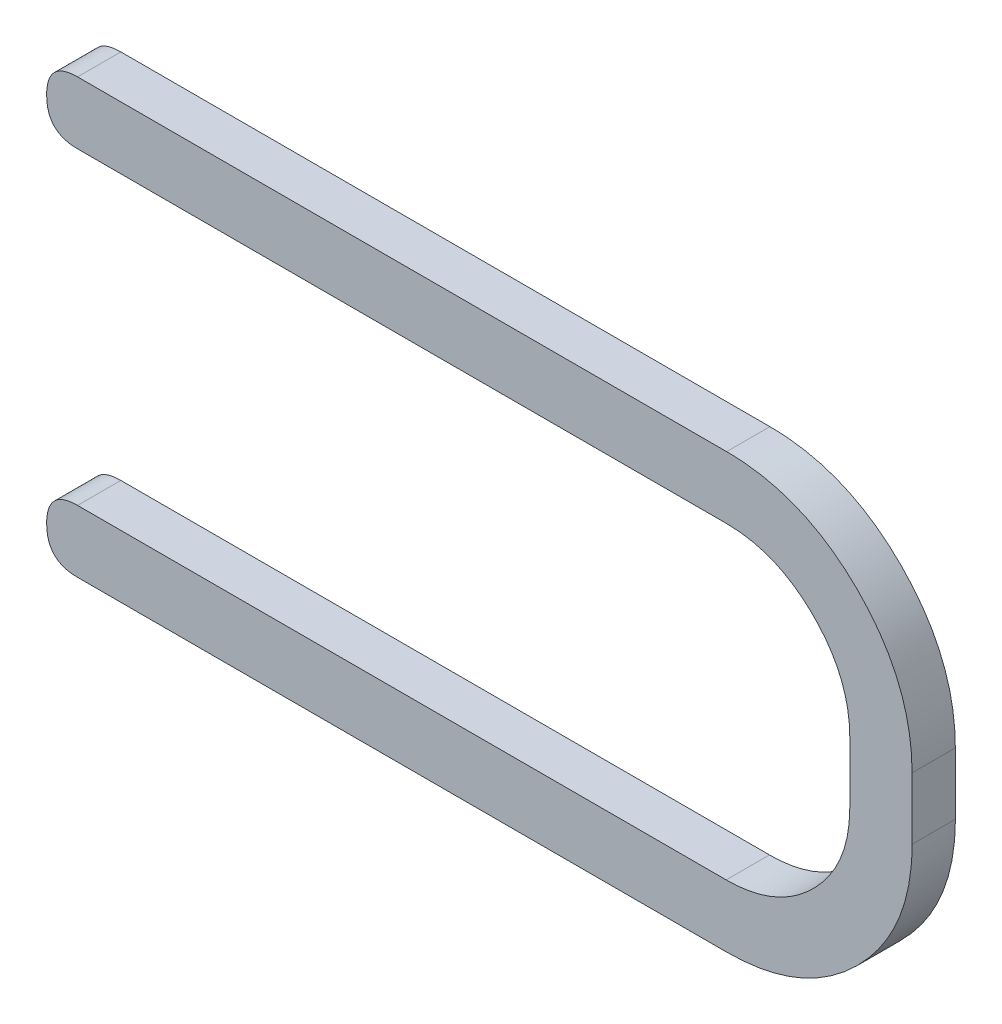
ISO-10303-21;
HEADER;
FILE_DESCRIPTION(('STEP AP214'),'2;1');
FILE_NAME('part.step','',(''),(''),'','','');
FILE_SCHEMA(('AUTOMOTIVE_DESIGN { 1 0 10303 214 1 1 1 1 }'));
ENDSEC;
DATA;
#1=APPLICATION_CONTEXT('core data for automotive mechanical design processes');
#2=APPLICATION_PROTOCOL_DEFINITION('international standard','automotive_design',2000,#1);
#3=PRODUCT_CONTEXT('',#1,'mechanical');
#4=PRODUCT('Part','Part','',(#3));
#5=PRODUCT_RELATED_PRODUCT_CATEGORY('part','',(#4));
#6=PRODUCT_DEFINITION_FORMATION('','',#4);
#7=PRODUCT_DEFINITION_CONTEXT('part definition',#1,'design');
#8=PRODUCT_DEFINITION('design','',#6,#7);
#9=PRODUCT_DEFINITION_SHAPE('','',#8);
#10=(LENGTH_UNIT() NAMED_UNIT(*) SI_UNIT(.MILLI.,.METRE.));
#11=(NAMED_UNIT(*) PLANE_ANGLE_UNIT() SI_UNIT($,.RADIAN.));
#12=(NAMED_UNIT(*) SI_UNIT($,.STERADIAN.) SOLID_ANGLE_UNIT());
#13=UNCERTAINTY_MEASURE_WITH_UNIT(LENGTH_MEASURE(1.E-05),#10,'distance_accuracy_value','');
#14=(GEOMETRIC_REPRESENTATION_CONTEXT(3) GLOBAL_UNCERTAINTY_ASSIGNED_CONTEXT((#13)) GLOBAL_UNIT_ASSIGNED_CONTEXT((#10,
#11,#12)) REPRESENTATION_CONTEXT('',''));
#15=CARTESIAN_POINT('',(0.,0.,0.));
#16=DIRECTION('',(0.,0.,1.));
#17=DIRECTION('',(1.,0.,0.));
#18=AXIS2_PLACEMENT_3D('',#15,#16,#17);
#19=CARTESIAN_POINT('',(0.8,12.2,-2.6));
#20=DIRECTION('',(0.,0.,1.));
#21=DIRECTION('',(1.,0.,0.));
#22=AXIS2_PLACEMENT_3D('',#19,#20,#21);
#23=PLANE('',#22);
#24=CARTESIAN_POINT('',(-2.2986,15.6116,-2.6));
#25=CARTESIAN_POINT('',(-2.37,15.6116,-2.6));
#26=CARTESIAN_POINT('',(-2.37,15.5396,-2.6));
#27=B_SPLINE_CURVE_WITH_KNOTS('',2,(#24,#25,#26),.UNSPECIFIED.,.F.,.F.,(3,3),(0.,1.),.UNSPECIFIED.);
#28=CARTESIAN_POINT('',(-2.2986,15.6116,-2.6));
#29=VERTEX_POINT('',#28);
#30=CARTESIAN_POINT('',(-2.37,15.5396,-2.6));
#31=VERTEX_POINT('',#30);
#32=EDGE_CURVE('E175',#29,#31,#27,.T.);
#33=ORIENTED_EDGE('',*,*,#32,.T.);
#34=CARTESIAN_POINT('',(-2.37,15.5396,-2.6));
#35=CARTESIAN_POINT('',(-2.37,15.4676,-2.6));
#36=CARTESIAN_POINT('',(-2.29855,15.4676,-2.6));
#37=B_SPLINE_CURVE_WITH_KNOTS('',2,(#34,#35,#36),.UNSPECIFIED.,.F.,.F.,(3,3),(0.,1.),.UNSPECIFIED.);
#38=CARTESIAN_POINT('',(-2.29855,15.4676,-2.6));
#39=VERTEX_POINT('',#38);
#40=EDGE_CURVE('E137',#31,#39,#37,.T.);
#41=ORIENTED_EDGE('',*,*,#40,.T.);
#42=DIRECTION('',(1.,0.,0.));
#43=VECTOR('',#42,1.);
#44=CARTESIAN_POINT('',(-2.29855,15.4676,-2.6));
#45=LINE('',#44,#43);
#46=CARTESIAN_POINT('',(-0.79855,15.4676,-2.6));
#47=VERTEX_POINT('',#46);
#48=EDGE_CURVE('E132',#47,#39,#45,.F.);
#49=ORIENTED_EDGE('',*,*,#48,.F.);
#50=CARTESIAN_POINT('',(-0.79855,15.4676,-2.6));
#51=CARTESIAN_POINT('',(-0.785758754690316,15.4676000873071,-2.6));
#52=CARTESIAN_POINT('',(-0.772967884589739,15.4680850022665,-2.6));
#53=CARTESIAN_POINT('',(-0.747456477785844,15.4701104376666,-2.6));
#54=CARTESIAN_POINT('',(-0.734736038734417,15.4716521698536,-2.6));
#55=CARTESIAN_POINT('',(-0.697046095054838,15.4779540294479,-2.6));
#56=CARTESIAN_POINT('',(-0.672325320018481,15.4843880502214,-2.6));
#57=CARTESIAN_POINT('',(-0.624425176586373,15.5019679591174,-2.6));
#58=CARTESIAN_POINT('',(-0.601257986872031,15.5131469491276,-2.6));
#59=CARTESIAN_POINT('',(-0.557420812279757,15.5397049989876,-2.6));
#60=CARTESIAN_POINT('',(-0.536756010980438,15.555092569025,-2.6));
#61=CARTESIAN_POINT('',(-0.508860794603653,15.5797240141623,-2.6));
#62=CARTESIAN_POINT('',(-0.500475424545598,15.5877120958485,-2.6));
#63=CARTESIAN_POINT('',(-0.484280586847549,15.604252016356,-2.6));
#64=CARTESIAN_POINT('',(-0.476471051036431,15.6128037882161,-2.6));
#65=CARTESIAN_POINT('',(-0.454072680819928,15.6392921440121,-2.6));
#66=CARTESIAN_POINT('',(-0.440476889613088,15.6580942144109,-2.6));
#67=CARTESIAN_POINT('',(-0.415369323938726,15.6998927661169,-2.6));
#68=CARTESIAN_POINT('',(-0.404242573472485,15.7231229713373,-2.6));
#69=CARTESIAN_POINT('',(-0.386674607079635,15.7713086245499,-2.6));
#70=CARTESIAN_POINT('',(-0.380235861175131,15.7962649744443,-2.6));
#71=CARTESIAN_POINT('',(-0.373983102161297,15.8341473425057,-2.6));
#72=CARTESIAN_POINT('',(-0.372466068774811,15.8468239631022,-2.6));
#73=CARTESIAN_POINT('',(-0.370476325657427,15.8722170305968,-2.6));
#74=CARTESIAN_POINT('',(-0.370000107297172,15.8849331985267,-2.6));
#75=CARTESIAN_POINT('',(-0.37,15.89765,-2.6));
#76=B_SPLINE_CURVE_WITH_KNOTS('',3,(#50,#51,#52,#53,#54,#55,#56,#57,#58,#59,#60,#61,#62,#63,#64,
#65,#66,#67,#68,#69,#70,#71,#72,#73,#74,#75),.UNSPECIFIED.,.F.,.F.,(4,2,2,2,2,2,2,2,2,2,2,2,4),
(0.,0.0383597249058377,0.0767635067860793,0.152912007118389,0.229600699831222,0.306445626442538,
0.341168143386282,0.375886543023313,0.445176714901746,0.521969103227123,0.59880192280721,
0.637067474253096,0.675203830728843),.UNSPECIFIED.);
#77=CARTESIAN_POINT('',(-0.37,15.89765,-2.6));
#78=VERTEX_POINT('',#77);
#79=EDGE_CURVE('E23',#47,#78,#76,.T.);
#80=ORIENTED_EDGE('',*,*,#79,.T.);
#81=DIRECTION('',(0.,1.,0.));
#82=VECTOR('',#81,1.);
#83=CARTESIAN_POINT('',(-0.37,15.89765,-2.6));
#84=LINE('',#83,#82);
#85=CARTESIAN_POINT('',(-0.37,16.04055,-2.6));
#86=VERTEX_POINT('',#85);
#87=EDGE_CURVE('E130',#86,#78,#84,.F.);
#88=ORIENTED_EDGE('',*,*,#87,.F.);
#89=CARTESIAN_POINT('',(-0.37,16.04055,-2.6));
#90=CARTESIAN_POINT('',(-0.369999963142466,16.0532035256561,-2.6));
#91=CARTESIAN_POINT('',(-0.370481893878974,16.0658563792372,-2.6));
#92=CARTESIAN_POINT('',(-0.372490568565311,16.0910914319626,-2.6));
#93=CARTESIAN_POINT('',(-0.374018439995517,16.1036735400752,-2.6));
#94=CARTESIAN_POINT('',(-0.3802535146966,16.1409436668852,-2.6));
#95=CARTESIAN_POINT('',(-0.386609462188308,16.1653862179417,-2.6));
#96=CARTESIAN_POINT('',(-0.403595347331003,16.2118760403822,-2.6));
#97=CARTESIAN_POINT('',(-0.414088088347112,16.2339738089796,-2.6));
#98=CARTESIAN_POINT('',(-0.438883116715943,16.2759693577917,-2.6));
#99=CARTESIAN_POINT('',(-0.453193215650833,16.2958625071196,-2.6));
#100=CARTESIAN_POINT('',(-0.476470730071651,16.3233119879343,-2.6));
#101=CARTESIAN_POINT('',(-0.484303854798931,16.3318665319929,-2.6));
#102=CARTESIAN_POINT('',(-0.500540738929671,16.3484161046309,-2.6));
#103=CARTESIAN_POINT('',(-0.508944490824041,16.3564111405703,-2.6));
#104=CARTESIAN_POINT('',(-0.53499270742424,16.3794158084315,-2.6));
#105=CARTESIAN_POINT('',(-0.553500763187399,16.3934766128159,-2.6));
#106=CARTESIAN_POINT('',(-0.595075125060725,16.419844162251,-2.6));
#107=CARTESIAN_POINT('',(-0.618422055348046,16.4317147395677,-2.6));
#108=CARTESIAN_POINT('',(-0.667017614435689,16.450593756966,-2.6));
#109=CARTESIAN_POINT('',(-0.69226649710964,16.4576015466808,-2.6));
#110=CARTESIAN_POINT('',(-0.731224290960496,16.464608463333,-2.6));
#111=CARTESIAN_POINT('',(-0.744650563425109,16.4663572519641,-2.6));
#112=CARTESIAN_POINT('',(-0.771568290510009,16.4686516205096,-2.6));
#113=CARTESIAN_POINT('',(-0.785059448199537,16.469200633078,-2.6));
#114=CARTESIAN_POINT('',(-0.79855,16.4692,-2.6));
#115=B_SPLINE_CURVE_WITH_KNOTS('',3,(#89,#90,#91,#92,#93,#94,#95,#96,#97,#98,#99,#100,#101,#102,
#103,#104,#105,#106,#107,#108,#109,#110,#111,#112,#113,#114),.UNSPECIFIED.,.F.,.F.,(4,2,2,2,2,2,
2,2,2,2,2,2,4),(0.,0.037946193361246,0.0759333556773588,0.151224643708381,0.224204574427343,
0.297335007418448,0.332109916788923,0.366884368632385,0.436310406936036,0.514377891109089,
0.592455814300214,0.633028793819158,0.67348553802783),.UNSPECIFIED.);
#116=CARTESIAN_POINT('',(-0.79855,16.4692,-2.6));
#117=VERTEX_POINT('',#116);
#118=EDGE_CURVE('E191',#86,#117,#115,.T.);
#119=ORIENTED_EDGE('',*,*,#118,.T.);
#120=DIRECTION('',(1.,0.,0.));
#121=VECTOR('',#120,1.);
#122=CARTESIAN_POINT('',(-0.79855,16.4692,-2.6));
#123=LINE('',#122,#121);
#124=CARTESIAN_POINT('',(-2.29855,16.4692,-2.6));
#125=VERTEX_POINT('',#124);
#126=EDGE_CURVE('E196',#125,#117,#123,.T.);
#127=ORIENTED_EDGE('',*,*,#126,.F.);
#128=CARTESIAN_POINT('',(-2.29855,16.4692,-2.6));
#129=CARTESIAN_POINT('',(-2.37,16.4692,-2.6));
#130=CARTESIAN_POINT('',(-2.37,16.3972,-2.6));
#131=B_SPLINE_CURVE_WITH_KNOTS('',2,(#128,#129,#130),.UNSPECIFIED.,.F.,.F.,(3,3),(0.,1.),.UNSPECIFIED.);
#132=CARTESIAN_POINT('',(-2.37,16.3972,-2.6));
#133=VERTEX_POINT('',#132);
#134=EDGE_CURVE('E145',#125,#133,#131,.T.);
#135=ORIENTED_EDGE('',*,*,#134,.T.);
#136=CARTESIAN_POINT('',(-2.37,16.3972,-2.6));
#137=CARTESIAN_POINT('',(-2.37,16.3252,-2.6));
#138=CARTESIAN_POINT('',(-2.2986,16.3252,-2.6));
#139=B_SPLINE_CURVE_WITH_KNOTS('',2,(#136,#137,#138),.UNSPECIFIED.,.F.,.F.,(3,3),(0.,1.),.UNSPECIFIED.);
#140=CARTESIAN_POINT('',(-2.2986,16.3252,-2.6));
#141=VERTEX_POINT('',#140);
#142=EDGE_CURVE('E150',#133,#141,#139,.T.);
#143=ORIENTED_EDGE('',*,*,#142,.T.);
#144=DIRECTION('',(1.,0.,0.));
#145=VECTOR('',#144,1.);
#146=CARTESIAN_POINT('',(-2.2986,16.3252,-2.6));
#147=LINE('',#146,#145);
#148=CARTESIAN_POINT('',(-0.79955,16.3252,-2.6));
#149=VERTEX_POINT('',#148);
#150=EDGE_CURVE('E341',#149,#141,#147,.F.);
#151=ORIENTED_EDGE('',*,*,#150,.F.);
#152=CARTESIAN_POINT('',(-0.79955,16.3252,-2.6));
#153=CARTESIAN_POINT('',(-0.79104622675567,16.3252001769341,-2.6));
#154=CARTESIAN_POINT('',(-0.782542966866627,16.3248668766136,-2.6));
#155=CARTESIAN_POINT('',(-0.765587468023152,16.3234800300884,-2.6));
#156=CARTESIAN_POINT('',(-0.757135289963014,16.3224257495148,-2.6));
#157=CARTESIAN_POINT('',(-0.732128641437156,16.3181318091377,-2.6));
#158=CARTESIAN_POINT('',(-0.715747241049907,16.3137630674496,-2.6));
#159=CARTESIAN_POINT('',(-0.684940633341291,16.3022566170283,-2.6));
#160=CARTESIAN_POINT('',(-0.670458424690063,16.2952697789084,-2.6));
#161=CARTESIAN_POINT('',(-0.642913555950682,16.2788517194929,-2.6));
#162=CARTESIAN_POINT('',(-0.629854372335545,16.269414694366,-2.6));
#163=CARTESIAN_POINT('',(-0.611681562726421,16.2540059897033,-2.6));
#164=CARTESIAN_POINT('',(-0.605938057493408,16.2487508432242,-2.6));
#165=CARTESIAN_POINT('',(-0.594822348587737,16.2378612709782,-2.6));
#166=CARTESIAN_POINT('',(-0.589450145197596,16.2322268449227,-2.6));
#167=CARTESIAN_POINT('',(-0.573986091986635,16.2147645571266,-2.6));
#168=CARTESIAN_POINT('',(-0.564525859163179,16.2023600588594,-2.6));
#169=CARTESIAN_POINT('',(-0.546722876400678,16.1743915572172,-2.6));
#170=CARTESIAN_POINT('',(-0.538690757897049,16.1586265832882,-2.6));
#171=CARTESIAN_POINT('',(-0.525981266392474,16.1257920984346,-2.6));
#172=CARTESIAN_POINT('',(-0.521303262648689,16.108722833451,-2.6));
#173=CARTESIAN_POINT('',(-0.516821364235494,16.0829589117275,-2.6));
#174=CARTESIAN_POINT('',(-0.515748153544826,16.0744606295875,-2.6));
#175=CARTESIAN_POINT('',(-0.514338410516615,16.0574250189643,-2.6));
#176=CARTESIAN_POINT('',(-0.51399993339174,16.0488878536476,-2.6));
#177=CARTESIAN_POINT('',(-0.514,16.04035,-2.6));
#178=B_SPLINE_CURVE_WITH_KNOTS('',3,(#152,#153,#154,#155,#156,#157,#158,#159,#160,#161,#162,
#163,#164,#165,#166,#167,#168,#169,#170,#171,#172,#173,#174,#175,#176,#177),.UNSPECIFIED.,.F.,
.F.,(4,2,2,2,2,2,2,2,2,2,2,2,4),(0.,0.0255011166655582,0.0510282467641538,0.101559426317524,
0.149540412215996,0.197636105805527,0.220975971305421,0.244315854563998,0.290914246820122,
0.343641538893741,0.396358912973165,0.4220296944181,0.447632443856186),.UNSPECIFIED.);
#179=CARTESIAN_POINT('',(-0.514,16.04035,-2.6));
#180=VERTEX_POINT('',#179);
#181=EDGE_CURVE('E186',#149,#180,#178,.T.);
#182=ORIENTED_EDGE('',*,*,#181,.T.);
#183=DIRECTION('',(0.,1.,0.));
#184=VECTOR('',#183,1.);
#185=CARTESIAN_POINT('',(-0.514,16.04035,-2.6));
#186=LINE('',#185,#184);
#187=CARTESIAN_POINT('',(-0.514,15.8979,-2.6));
#188=VERTEX_POINT('',#187);
#189=EDGE_CURVE('E335',#188,#180,#186,.T.);
#190=ORIENTED_EDGE('',*,*,#189,.F.);
#191=CARTESIAN_POINT('',(-0.514,15.8979,-2.6));
#192=CARTESIAN_POINT('',(-0.513999993105663,15.8893732873373,-2.6));
#193=CARTESIAN_POINT('',(-0.514326464758152,15.880847011113,-2.6));
#194=CARTESIAN_POINT('',(-0.515687513722648,15.8638426063795,-2.6));
#195=CARTESIAN_POINT('',(-0.516722864525606,15.8553645406743,-2.6));
#196=CARTESIAN_POINT('',(-0.520948152722729,15.8302563295604,-2.6));
#197=CARTESIAN_POINT('',(-0.525255437976938,15.8137934696674,-2.6));
#198=CARTESIAN_POINT('',(-0.536730724752398,15.7825835012905,-2.6));
#199=CARTESIAN_POINT('',(-0.543789199017242,15.7677958027315,-2.6));
#200=CARTESIAN_POINT('',(-0.560453610784045,15.7396963456425,-2.6));
#201=CARTESIAN_POINT('',(-0.570065039500177,15.7263878573679,-2.6));
#202=CARTESIAN_POINT('',(-0.585696319721574,15.7080167295649,-2.6));
#203=CARTESIAN_POINT('',(-0.590960140025202,15.7022865332308,-2.6));
#204=CARTESIAN_POINT('',(-0.60187235852147,15.6912047309637,-2.6));
#205=CARTESIAN_POINT('',(-0.607520740457681,15.685853109047,-2.6));
#206=CARTESIAN_POINT('',(-0.625035748293147,15.6704737543815,-2.6));
#207=CARTESIAN_POINT('',(-0.637492444563951,15.6610975280747,-2.6));
#208=CARTESIAN_POINT('',(-0.665280754577148,15.643696939687,-2.6));
#209=CARTESIAN_POINT('',(-0.680777832303239,15.6359334856064,-2.6));
#210=CARTESIAN_POINT('',(-0.713008921651333,15.6236138979906,-2.6));
#211=CARTESIAN_POINT('',(-0.729743364787815,15.6190588892422,-2.6));
#212=CARTESIAN_POINT('',(-0.755456022041528,15.6145391418314,-2.6));
#213=CARTESIAN_POINT('',(-0.764252639511527,15.6134194353041,-2.6));
#214=CARTESIAN_POINT('',(-0.781883034002901,15.6119509610746,-2.6));
#215=CARTESIAN_POINT('',(-0.790716606592621,15.6115997752445,-2.6));
#216=CARTESIAN_POINT('',(-0.79955,15.6116,-2.6));
#217=B_SPLINE_CURVE_WITH_KNOTS('',3,(#191,#192,#193,#194,#195,#196,#197,#198,#199,#200,#201,
#202,#203,#204,#205,#206,#207,#208,#209,#210,#211,#212,#213,#214,#215,#216),.UNSPECIFIED.,.F.,
.F.,(4,2,2,2,2,2,2,2,2,2,2,2,4),(0.,0.025570369029394,0.0511686836340223,0.101895581078892,
0.150780970834164,0.199772373060557,0.223100219312008,0.246427080045735,0.292987565259326,
0.344652650372124,0.396335838744305,0.422910017233123,0.449400459898986),.UNSPECIFIED.);
#218=CARTESIAN_POINT('',(-0.79955,15.6116,-2.6));
#219=VERTEX_POINT('',#218);
#220=EDGE_CURVE('E179',#188,#219,#217,.T.);
#221=ORIENTED_EDGE('',*,*,#220,.T.);
#222=DIRECTION('',(1.,0.,0.));
#223=VECTOR('',#222,1.);
#224=CARTESIAN_POINT('',(-0.79955,15.6116,-2.6));
#225=LINE('',#224,#223);
#226=EDGE_CURVE('E329',#29,#219,#225,.T.);
#227=ORIENTED_EDGE('',*,*,#226,.F.);
#228=EDGE_LOOP('',(#33,#41,#49,#80,#88,#119,#127,#135,#143,#151,#182,#190,#221,#227));
#229=FACE_BOUND('',#228,.T.);
#230=ADVANCED_FACE('F17',(#229),#23,.T.);
#231=CARTESIAN_POINT('',(-0.79855,15.4676,-2.7));
#232=CARTESIAN_POINT('',(-0.62,15.4676,-2.7));
#233=CARTESIAN_POINT('',(-0.37,15.71905,-2.7));
#234=CARTESIAN_POINT('',(-0.37,15.89765,-2.7));
#235=CARTESIAN_POINT('',(-0.79855,15.4676,-2.6));
#236=CARTESIAN_POINT('',(-0.62,15.4676,-2.6));
#237=CARTESIAN_POINT('',(-0.37,15.71905,-2.6));
#238=CARTESIAN_POINT('',(-0.37,15.89765,-2.6));
#239=B_SPLINE_SURFACE_WITH_KNOTS('',1,2,((#231,#232,#233,#234),(#235,#236,#237,#238)),
.UNSPECIFIED.,.F.,.F.,.F.,(2,2),(3,1,3),(0.,1.),(0.,0.5,1.),.UNSPECIFIED.);
#240=DIRECTION('',(0.,0.,-1.));
#241=VECTOR('',#240,1.);
#242=CARTESIAN_POINT('',(-0.79855,15.4676,-2.7));
#243=LINE('',#242,#241);
#244=CARTESIAN_POINT('',(-0.79855,15.4676,-2.7));
#245=VERTEX_POINT('',#244);
#246=EDGE_CURVE('E126',#245,#47,#243,.F.);
#247=CARTESIAN_POINT('',(-0.79855,15.4676,-2.7));
#248=CARTESIAN_POINT('',(-0.785758754690316,15.4676000873071,-2.7));
#249=CARTESIAN_POINT('',(-0.772967884589738,15.4680850022665,-2.7));
#250=CARTESIAN_POINT('',(-0.747456477785843,15.4701104376666,-2.7));
#251=CARTESIAN_POINT('',(-0.734736038734417,15.4716521698536,-2.7));
#252=CARTESIAN_POINT('',(-0.697046095054838,15.4779540294479,-2.7));
#253=CARTESIAN_POINT('',(-0.672325320018481,15.4843880502214,-2.7));
#254=CARTESIAN_POINT('',(-0.624425176586374,15.5019679591174,-2.7));
#255=CARTESIAN_POINT('',(-0.601257986872031,15.5131469491276,-2.7));
#256=CARTESIAN_POINT('',(-0.557420812279756,15.5397049989876,-2.7));
#257=CARTESIAN_POINT('',(-0.536756010980436,15.555092569025,-2.7));
#258=CARTESIAN_POINT('',(-0.508860794603652,15.5797240141623,-2.7));
#259=CARTESIAN_POINT('',(-0.500475424545598,15.5877120958485,-2.7));
#260=CARTESIAN_POINT('',(-0.484280586847551,15.604252016356,-2.7));
#261=CARTESIAN_POINT('',(-0.476471051036434,15.6128037882161,-2.7));
#262=CARTESIAN_POINT('',(-0.45407268081993,15.6392921440121,-2.7));
#263=CARTESIAN_POINT('',(-0.440476889613091,15.6580942144109,-2.7));
#264=CARTESIAN_POINT('',(-0.415369323938729,15.6998927661169,-2.7));
#265=CARTESIAN_POINT('',(-0.404242573472488,15.7231229713373,-2.7));
#266=CARTESIAN_POINT('',(-0.386674607079638,15.7713086245498,-2.7));
#267=CARTESIAN_POINT('',(-0.380235861175133,15.7962649744443,-2.7));
#268=CARTESIAN_POINT('',(-0.373983102161298,15.8341473425057,-2.7));
#269=CARTESIAN_POINT('',(-0.372466068774812,15.8468239631022,-2.7));
#270=CARTESIAN_POINT('',(-0.370476325657427,15.8722170305968,-2.7));
#271=CARTESIAN_POINT('',(-0.370000107297172,15.8849331985267,-2.7));
#272=CARTESIAN_POINT('',(-0.37,15.89765,-2.7));
#273=B_SPLINE_CURVE_WITH_KNOTS('',3,(#247,#248,#249,#250,#251,#252,#253,#254,#255,#256,#257,
#258,#259,#260,#261,#262,#263,#264,#265,#266,#267,#268,#269,#270,#271,#272),.UNSPECIFIED.,.F.,
.F.,(4,2,2,2,2,2,2,2,2,2,2,2,4),(0.,0.0383597249058384,0.0767635067860795,0.15291200711839,
0.229600699831223,0.306445626442539,0.34116814338628,0.375886543023307,0.445176714901738,
0.521969103227116,0.598801922807203,0.637067474253092,0.675203830728843),.UNSPECIFIED.);
#274=CARTESIAN_POINT('',(-0.37,15.89765,-2.7));
#275=VERTEX_POINT('',#274);
#276=EDGE_CURVE('E134',#245,#275,#273,.T.);
#277=DIRECTION('',(0.,0.,-1.));
#278=VECTOR('',#277,1.);
#279=CARTESIAN_POINT('',(-0.37,15.89765,-2.7));
#280=LINE('',#279,#278);
#281=EDGE_CURVE('E127',#78,#275,#280,.T.);
#282=ORIENTED_EDGE('',*,*,#246,.F.);
#283=ORIENTED_EDGE('',*,*,#276,.T.);
#284=ORIENTED_EDGE('',*,*,#281,.F.);
#285=ORIENTED_EDGE('',*,*,#79,.F.);
#286=EDGE_LOOP('',(#282,#283,#284,#285));
#287=FACE_BOUND('',#286,.T.);
#288=ADVANCED_FACE('F124',(#287),#239,.F.);
#289=CARTESIAN_POINT('',(-0.37,15.89765,-2.7));
#290=DIRECTION('',(1.,0.,0.));
#291=DIRECTION('',(0.,0.,-1.));
#292=AXIS2_PLACEMENT_3D('',#289,#290,#291);
#293=PLANE('',#292);
#294=DIRECTION('',(0.,1.,0.));
#295=VECTOR('',#294,1.);
#296=CARTESIAN_POINT('',(-0.37,12.2,-2.7));
#297=LINE('',#296,#295);
#298=CARTESIAN_POINT('',(-0.37,16.04055,-2.7));
#299=VERTEX_POINT('',#298);
#300=EDGE_CURVE('E225',#275,#299,#297,.T.);
#301=ORIENTED_EDGE('',*,*,#300,.T.);
#302=DIRECTION('',(0.,0.,1.));
#303=VECTOR('',#302,1.);
#304=CARTESIAN_POINT('',(-0.37,16.04055,-2.65));
#305=LINE('',#304,#303);
#306=EDGE_CURVE('E197',#299,#86,#305,.T.);
#307=ORIENTED_EDGE('',*,*,#306,.T.);
#308=ORIENTED_EDGE('',*,*,#87,.T.);
#309=ORIENTED_EDGE('',*,*,#281,.T.);
#310=EDGE_LOOP('',(#301,#307,#308,#309));
#311=FACE_BOUND('',#310,.T.);
#312=ADVANCED_FACE('F161',(#311),#293,.T.);
#313=CARTESIAN_POINT('',(-0.37,16.04055,-2.7));
#314=CARTESIAN_POINT('',(-0.37,16.21775,-2.7));
#315=CARTESIAN_POINT('',(-0.62145,16.4692,-2.7));
#316=CARTESIAN_POINT('',(-0.79855,16.4692,-2.7));
#317=CARTESIAN_POINT('',(-0.37,16.04055,-2.6));
#318=CARTESIAN_POINT('',(-0.37,16.21775,-2.6));
#319=CARTESIAN_POINT('',(-0.62145,16.4692,-2.6));
#320=CARTESIAN_POINT('',(-0.79855,16.4692,-2.6));
#321=B_SPLINE_SURFACE_WITH_KNOTS('',1,2,((#313,#314,#315,#316),(#317,#318,#319,#320)),
.UNSPECIFIED.,.F.,.F.,.F.,(2,2),(3,1,3),(0.,1.),(0.,0.5,1.),.UNSPECIFIED.);
#322=CARTESIAN_POINT('',(-0.37,16.04055,-2.7));
#323=CARTESIAN_POINT('',(-0.369999963142466,16.0532035256561,-2.7));
#324=CARTESIAN_POINT('',(-0.370481893878974,16.0658563792372,-2.7));
#325=CARTESIAN_POINT('',(-0.372490568565311,16.0910914319626,-2.7));
#326=CARTESIAN_POINT('',(-0.374018439995517,16.1036735400752,-2.7));
#327=CARTESIAN_POINT('',(-0.380253514696599,16.1409436668852,-2.7));
#328=CARTESIAN_POINT('',(-0.386609462188308,16.1653862179417,-2.7));
#329=CARTESIAN_POINT('',(-0.403595347331003,16.2118760403822,-2.7));
#330=CARTESIAN_POINT('',(-0.414088088347112,16.2339738089796,-2.7));
#331=CARTESIAN_POINT('',(-0.438883116715942,16.2759693577917,-2.7));
#332=CARTESIAN_POINT('',(-0.453193215650832,16.2958625071196,-2.7));
#333=CARTESIAN_POINT('',(-0.476470730071649,16.3233119879343,-2.7));
#334=CARTESIAN_POINT('',(-0.48430385479893,16.3318665319929,-2.7));
#335=CARTESIAN_POINT('',(-0.500540738929672,16.3484161046309,-2.7));
#336=CARTESIAN_POINT('',(-0.508944490824043,16.3564111405703,-2.7));
#337=CARTESIAN_POINT('',(-0.534992707424245,16.3794158084315,-2.7));
#338=CARTESIAN_POINT('',(-0.553500763187405,16.3934766128159,-2.7));
#339=CARTESIAN_POINT('',(-0.595075125060732,16.419844162251,-2.7));
#340=CARTESIAN_POINT('',(-0.618422055348053,16.4317147395677,-2.7));
#341=CARTESIAN_POINT('',(-0.667017614435693,16.450593756966,-2.7));
#342=CARTESIAN_POINT('',(-0.692266497109641,16.4576015466808,-2.7));
#343=CARTESIAN_POINT('',(-0.731224290960495,16.464608463333,-2.7));
#344=CARTESIAN_POINT('',(-0.744650563425109,16.4663572519641,-2.7));
#345=CARTESIAN_POINT('',(-0.771568290510009,16.4686516205096,-2.7));
#346=CARTESIAN_POINT('',(-0.785059448199537,16.469200633078,-2.7));
#347=CARTESIAN_POINT('',(-0.79855,16.4692,-2.7));
#348=B_SPLINE_CURVE_WITH_KNOTS('',3,(#322,#323,#324,#325,#326,#327,#328,#329,#330,#331,#332,
#333,#334,#335,#336,#337,#338,#339,#340,#341,#342,#343,#344,#345,#346,#347),.UNSPECIFIED.,.F.,
.F.,(4,2,2,2,2,2,2,2,2,2,2,2,4),(0.,0.037946193361246,0.0759333556773587,0.151224643708381,
0.224204574427342,0.297335007418447,0.332109916788926,0.36688436863239,0.436310406936045,
0.514377891109092,0.592455814300214,0.633028793819157,0.67348553802783),.UNSPECIFIED.);
#349=CARTESIAN_POINT('',(-0.79855,16.4692,-2.7));
#350=VERTEX_POINT('',#349);
#351=EDGE_CURVE('E217',#299,#350,#348,.T.);
#352=DIRECTION('',(0.,0.,1.));
#353=VECTOR('',#352,1.);
#354=CARTESIAN_POINT('',(-0.79855,16.4692,-2.7));
#355=LINE('',#354,#353);
#356=EDGE_CURVE('E346',#117,#350,#355,.F.);
#357=ORIENTED_EDGE('',*,*,#306,.F.);
#358=ORIENTED_EDGE('',*,*,#351,.T.);
#359=ORIENTED_EDGE('',*,*,#356,.F.);
#360=ORIENTED_EDGE('',*,*,#118,.F.);
#361=EDGE_LOOP('',(#357,#358,#359,#360));
#362=FACE_BOUND('',#361,.T.);
#363=ADVANCED_FACE('F198',(#362),#321,.F.);
#364=CARTESIAN_POINT('',(-0.79855,16.4692,-2.7));
#365=DIRECTION('',(0.,1.,0.));
#366=DIRECTION('',(0.,0.,1.));
#367=AXIS2_PLACEMENT_3D('',#364,#365,#366);
#368=PLANE('',#367);
#369=DIRECTION('',(1.,0.,0.));
#370=VECTOR('',#369,1.);
#371=CARTESIAN_POINT('',(0.8,16.4692,-2.7));
#372=LINE('',#371,#370);
#373=CARTESIAN_POINT('',(-2.29855,16.4692,-2.7));
#374=VERTEX_POINT('',#373);
#375=EDGE_CURVE('E224',#350,#374,#372,.F.);
#376=ORIENTED_EDGE('',*,*,#375,.T.);
#377=DIRECTION('',(0.,0.,1.));
#378=VECTOR('',#377,1.);
#379=CARTESIAN_POINT('',(-2.29855,16.4692,-2.65));
#380=LINE('',#379,#378);
#381=EDGE_CURVE('E149',#374,#125,#380,.T.);
#382=ORIENTED_EDGE('',*,*,#381,.T.);
#383=ORIENTED_EDGE('',*,*,#126,.T.);
#384=ORIENTED_EDGE('',*,*,#356,.T.);
#385=EDGE_LOOP('',(#376,#382,#383,#384));
#386=FACE_BOUND('',#385,.T.);
#387=ADVANCED_FACE('F204',(#386),#368,.T.);
#388=CARTESIAN_POINT('',(-2.29855,16.4692,-2.7));
#389=CARTESIAN_POINT('',(-2.37,16.4692,-2.7));
#390=CARTESIAN_POINT('',(-2.37,16.3972,-2.7));
#391=CARTESIAN_POINT('',(-2.29855,16.4692,-2.6));
#392=CARTESIAN_POINT('',(-2.37,16.4692,-2.6));
#393=CARTESIAN_POINT('',(-2.37,16.3972,-2.6));
#394=B_SPLINE_SURFACE_WITH_KNOTS('',1,2,((#388,#389,#390),(#391,#392,#393)),.UNSPECIFIED.,.F.,
.F.,.F.,(2,2),(3,3),(0.,1.),(0.,1.),.UNSPECIFIED.);
#395=CARTESIAN_POINT('',(-2.29855,16.4692,-2.7));
#396=CARTESIAN_POINT('',(-2.37,16.4692,-2.7));
#397=CARTESIAN_POINT('',(-2.37,16.3972,-2.7));
#398=B_SPLINE_CURVE_WITH_KNOTS('',2,(#395,#396,#397),.UNSPECIFIED.,.F.,.F.,(3,3),(0.,1.),.UNSPECIFIED.);
#399=CARTESIAN_POINT('',(-2.37,16.3972,-2.7));
#400=VERTEX_POINT('',#399);
#401=EDGE_CURVE('E245',#374,#400,#398,.T.);
#402=DIRECTION('',(0.,0.,1.));
#403=VECTOR('',#402,1.);
#404=CARTESIAN_POINT('',(-2.37,16.3972,-2.65));
#405=LINE('',#404,#403);
#406=EDGE_CURVE('E148',#400,#133,#405,.T.);
#407=ORIENTED_EDGE('',*,*,#381,.F.);
#408=ORIENTED_EDGE('',*,*,#401,.T.);
#409=ORIENTED_EDGE('',*,*,#406,.T.);
#410=ORIENTED_EDGE('',*,*,#134,.F.);
#411=EDGE_LOOP('',(#407,#408,#409,#410));
#412=FACE_BOUND('',#411,.T.);
#413=ADVANCED_FACE('F206',(#412),#394,.F.);
#414=CARTESIAN_POINT('',(-2.37,16.3972,-2.7));
#415=CARTESIAN_POINT('',(-2.37,16.3252,-2.7));
#416=CARTESIAN_POINT('',(-2.2986,16.3252,-2.7));
#417=CARTESIAN_POINT('',(-2.37,16.3972,-2.6));
#418=CARTESIAN_POINT('',(-2.37,16.3252,-2.6));
#419=CARTESIAN_POINT('',(-2.2986,16.3252,-2.6));
#420=B_SPLINE_SURFACE_WITH_KNOTS('',1,2,((#414,#415,#416),(#417,#418,#419)),.UNSPECIFIED.,.F.,
.F.,.F.,(2,2),(3,3),(0.,1.),(0.,1.),.UNSPECIFIED.);
#421=CARTESIAN_POINT('',(-2.37,16.3972,-2.7));
#422=CARTESIAN_POINT('',(-2.37,16.3252,-2.7));
#423=CARTESIAN_POINT('',(-2.2986,16.3252,-2.7));
#424=B_SPLINE_CURVE_WITH_KNOTS('',2,(#421,#422,#423),.UNSPECIFIED.,.F.,.F.,(3,3),(0.,1.),.UNSPECIFIED.);
#425=CARTESIAN_POINT('',(-2.2986,16.3252,-2.7));
#426=VERTEX_POINT('',#425);
#427=EDGE_CURVE('E249',#400,#426,#424,.T.);
#428=DIRECTION('',(0.,0.,-1.));
#429=VECTOR('',#428,1.);
#430=CARTESIAN_POINT('',(-2.2986,16.3252,-2.7));
#431=LINE('',#430,#429);
#432=EDGE_CURVE('E339',#141,#426,#431,.T.);
#433=ORIENTED_EDGE('',*,*,#406,.F.);
#434=ORIENTED_EDGE('',*,*,#427,.T.);
#435=ORIENTED_EDGE('',*,*,#432,.F.);
#436=ORIENTED_EDGE('',*,*,#142,.F.);
#437=EDGE_LOOP('',(#433,#434,#435,#436));
#438=FACE_BOUND('',#437,.T.);
#439=ADVANCED_FACE('F364',(#438),#420,.F.);
#440=CARTESIAN_POINT('',(-2.2986,16.3252,-2.7));
#441=DIRECTION('',(0.,-1.,0.));
#442=DIRECTION('',(0.,0.,-1.));
#443=AXIS2_PLACEMENT_3D('',#440,#441,#442);
#444=PLANE('',#443);
#445=DIRECTION('',(1.,0.,0.));
#446=VECTOR('',#445,1.);
#447=CARTESIAN_POINT('',(0.8,16.3252,-2.7));
#448=LINE('',#447,#446);
#449=CARTESIAN_POINT('',(-0.79955,16.3252,-2.7));
#450=VERTEX_POINT('',#449);
#451=EDGE_CURVE('E320',#426,#450,#448,.T.);
#452=ORIENTED_EDGE('',*,*,#451,.T.);
#453=DIRECTION('',(0.,0.,1.));
#454=VECTOR('',#453,1.);
#455=CARTESIAN_POINT('',(-0.79955,16.3252,-2.65));
#456=LINE('',#455,#454);
#457=EDGE_CURVE('E336',#450,#149,#456,.T.);
#458=ORIENTED_EDGE('',*,*,#457,.T.);
#459=ORIENTED_EDGE('',*,*,#150,.T.);
#460=ORIENTED_EDGE('',*,*,#432,.T.);
#461=EDGE_LOOP('',(#452,#458,#459,#460));
#462=FACE_BOUND('',#461,.T.);
#463=ADVANCED_FACE('F381',(#462),#444,.T.);
#464=CARTESIAN_POINT('',(-0.79955,16.3252,-2.7));
#465=CARTESIAN_POINT('',(-0.68245,16.3252,-2.7));
#466=CARTESIAN_POINT('',(-0.514,16.15715,-2.7));
#467=CARTESIAN_POINT('',(-0.514,16.04035,-2.7));
#468=CARTESIAN_POINT('',(-0.79955,16.3252,-2.6));
#469=CARTESIAN_POINT('',(-0.68245,16.3252,-2.6));
#470=CARTESIAN_POINT('',(-0.514,16.15715,-2.6));
#471=CARTESIAN_POINT('',(-0.514,16.04035,-2.6));
#472=B_SPLINE_SURFACE_WITH_KNOTS('',1,2,((#464,#465,#466,#467),(#468,#469,#470,#471)),
.UNSPECIFIED.,.F.,.F.,.F.,(2,2),(3,1,3),(0.,1.),(0.,0.5,1.),.UNSPECIFIED.);
#473=CARTESIAN_POINT('',(-0.79955,16.3252,-2.7));
#474=CARTESIAN_POINT('',(-0.791046226755671,16.3252001769341,-2.7));
#475=CARTESIAN_POINT('',(-0.782542966866627,16.3248668766136,-2.7));
#476=CARTESIAN_POINT('',(-0.765587468023152,16.3234800300884,-2.7));
#477=CARTESIAN_POINT('',(-0.757135289963014,16.3224257495148,-2.7));
#478=CARTESIAN_POINT('',(-0.732128641437156,16.3181318091377,-2.7));
#479=CARTESIAN_POINT('',(-0.715747241049907,16.3137630674496,-2.7));
#480=CARTESIAN_POINT('',(-0.684940633341292,16.3022566170283,-2.7));
#481=CARTESIAN_POINT('',(-0.670458424690063,16.2952697789084,-2.7));
#482=CARTESIAN_POINT('',(-0.642913555950683,16.2788517194929,-2.7));
#483=CARTESIAN_POINT('',(-0.629854372335548,16.269414694366,-2.7));
#484=CARTESIAN_POINT('',(-0.611681562726422,16.2540059897033,-2.7));
#485=CARTESIAN_POINT('',(-0.605938057493407,16.2487508432242,-2.7));
#486=CARTESIAN_POINT('',(-0.594822348587737,16.2378612709782,-2.7));
#487=CARTESIAN_POINT('',(-0.589450145197598,16.2322268449227,-2.7));
#488=CARTESIAN_POINT('',(-0.573986091986639,16.2147645571266,-2.7));
#489=CARTESIAN_POINT('',(-0.564525859163181,16.2023600588594,-2.7));
#490=CARTESIAN_POINT('',(-0.546722876400678,16.1743915572172,-2.7));
#491=CARTESIAN_POINT('',(-0.538690757897049,16.1586265832882,-2.7));
#492=CARTESIAN_POINT('',(-0.525981266392473,16.1257920984346,-2.7));
#493=CARTESIAN_POINT('',(-0.521303262648688,16.108722833451,-2.7));
#494=CARTESIAN_POINT('',(-0.516821364235493,16.0829589117274,-2.7));
#495=CARTESIAN_POINT('',(-0.515748153544826,16.0744606295875,-2.7));
#496=CARTESIAN_POINT('',(-0.514338410516615,16.0574250189643,-2.7));
#497=CARTESIAN_POINT('',(-0.51399993339174,16.0488878536476,-2.7));
#498=CARTESIAN_POINT('',(-0.514,16.04035,-2.7));
#499=B_SPLINE_CURVE_WITH_KNOTS('',3,(#473,#474,#475,#476,#477,#478,#479,#480,#481,#482,#483,
#484,#485,#486,#487,#488,#489,#490,#491,#492,#493,#494,#495,#496,#497,#498),.UNSPECIFIED.,.F.,
.F.,(4,2,2,2,2,2,2,2,2,2,2,2,4),(0.,0.0255011166655582,0.0510282467641536,0.101559426317524,
0.149540412215995,0.197636105805525,0.220975971305418,0.244315854563996,0.290914246820122,
0.343641538893741,0.396358912973168,0.4220296944181,0.447632443856186),.UNSPECIFIED.);
#500=CARTESIAN_POINT('',(-0.514,16.04035,-2.7));
#501=VERTEX_POINT('',#500);
#502=EDGE_CURVE('E226',#450,#501,#499,.T.);
#503=DIRECTION('',(0.,0.,1.));
#504=VECTOR('',#503,1.);
#505=CARTESIAN_POINT('',(-0.514,16.04035,-2.7));
#506=LINE('',#505,#504);
#507=EDGE_CURVE('E333',#180,#501,#506,.F.);
#508=ORIENTED_EDGE('',*,*,#457,.F.);
#509=ORIENTED_EDGE('',*,*,#502,.T.);
#510=ORIENTED_EDGE('',*,*,#507,.F.);
#511=ORIENTED_EDGE('',*,*,#181,.F.);
#512=EDGE_LOOP('',(#508,#509,#510,#511));
#513=FACE_BOUND('',#512,.T.);
#514=ADVANCED_FACE('F275',(#513),#472,.F.);
#515=CARTESIAN_POINT('',(-0.514,16.04035,-2.7));
#516=DIRECTION('',(-1.,0.,0.));
#517=DIRECTION('',(0.,0.,1.));
#518=AXIS2_PLACEMENT_3D('',#515,#516,#517);
#519=PLANE('',#518);
#520=DIRECTION('',(0.,1.,0.));
#521=VECTOR('',#520,1.);
#522=CARTESIAN_POINT('',(-0.514,12.2,-2.7));
#523=LINE('',#522,#521);
#524=CARTESIAN_POINT('',(-0.514,15.8979,-2.7));
#525=VERTEX_POINT('',#524);
#526=EDGE_CURVE('E265',#501,#525,#523,.F.);
#527=ORIENTED_EDGE('',*,*,#526,.T.);
#528=DIRECTION('',(0.,0.,1.));
#529=VECTOR('',#528,1.);
#530=CARTESIAN_POINT('',(-0.514,15.8979,-2.65));
#531=LINE('',#530,#529);
#532=EDGE_CURVE('E330',#525,#188,#531,.T.);
#533=ORIENTED_EDGE('',*,*,#532,.T.);
#534=ORIENTED_EDGE('',*,*,#189,.T.);
#535=ORIENTED_EDGE('',*,*,#507,.T.);
#536=EDGE_LOOP('',(#527,#533,#534,#535));
#537=FACE_BOUND('',#536,.T.);
#538=ADVANCED_FACE('F273',(#537),#519,.T.);
#539=CARTESIAN_POINT('',(-0.514,15.8979,-2.7));
#540=CARTESIAN_POINT('',(-0.514,15.77965,-2.7));
#541=CARTESIAN_POINT('',(-0.68105,15.6116,-2.7));
#542=CARTESIAN_POINT('',(-0.79955,15.6116,-2.7));
#543=CARTESIAN_POINT('',(-0.514,15.8979,-2.6));
#544=CARTESIAN_POINT('',(-0.514,15.77965,-2.6));
#545=CARTESIAN_POINT('',(-0.68105,15.6116,-2.6));
#546=CARTESIAN_POINT('',(-0.79955,15.6116,-2.6));
#547=B_SPLINE_SURFACE_WITH_KNOTS('',1,2,((#539,#540,#541,#542),(#543,#544,#545,#546)),
.UNSPECIFIED.,.F.,.F.,.F.,(2,2),(3,1,3),(0.,1.),(0.,0.5,1.),.UNSPECIFIED.);
#548=CARTESIAN_POINT('',(-0.514,15.8979,-2.7));
#549=CARTESIAN_POINT('',(-0.513999993105662,15.8893732873373,-2.7));
#550=CARTESIAN_POINT('',(-0.514326464758152,15.880847011113,-2.7));
#551=CARTESIAN_POINT('',(-0.515687513722648,15.8638426063795,-2.7));
#552=CARTESIAN_POINT('',(-0.516722864525607,15.8553645406743,-2.7));
#553=CARTESIAN_POINT('',(-0.52094815272273,15.8302563295604,-2.7));
#554=CARTESIAN_POINT('',(-0.525255437976938,15.8137934696674,-2.7));
#555=CARTESIAN_POINT('',(-0.536730724752397,15.7825835012905,-2.7));
#556=CARTESIAN_POINT('',(-0.543789199017241,15.7677958027315,-2.7));
#557=CARTESIAN_POINT('',(-0.560453610784043,15.7396963456425,-2.7));
#558=CARTESIAN_POINT('',(-0.570065039500175,15.7263878573679,-2.7));
#559=CARTESIAN_POINT('',(-0.585696319721575,15.7080167295649,-2.7));
#560=CARTESIAN_POINT('',(-0.590960140025204,15.7022865332308,-2.7));
#561=CARTESIAN_POINT('',(-0.601872358521471,15.6912047309637,-2.7));
#562=CARTESIAN_POINT('',(-0.607520740457681,15.685853109047,-2.7));
#563=CARTESIAN_POINT('',(-0.625035748293146,15.6704737543815,-2.7));
#564=CARTESIAN_POINT('',(-0.63749244456395,15.6610975280747,-2.7));
#565=CARTESIAN_POINT('',(-0.665280754577148,15.643696939687,-2.7));
#566=CARTESIAN_POINT('',(-0.680777832303241,15.6359334856064,-2.7));
#567=CARTESIAN_POINT('',(-0.713008921651334,15.6236138979906,-2.7));
#568=CARTESIAN_POINT('',(-0.729743364787815,15.6190588892422,-2.7));
#569=CARTESIAN_POINT('',(-0.755456022041528,15.6145391418314,-2.7));
#570=CARTESIAN_POINT('',(-0.764252639511527,15.6134194353041,-2.7));
#571=CARTESIAN_POINT('',(-0.781883034002901,15.6119509610746,-2.7));
#572=CARTESIAN_POINT('',(-0.790716606592621,15.6115997752445,-2.7));
#573=CARTESIAN_POINT('',(-0.79955,15.6116,-2.7));
#574=B_SPLINE_CURVE_WITH_KNOTS('',3,(#548,#549,#550,#551,#552,#553,#554,#555,#556,#557,#558,
#559,#560,#561,#562,#563,#564,#565,#566,#567,#568,#569,#570,#571,#572,#573),.UNSPECIFIED.,.F.,
.F.,(4,2,2,2,2,2,2,2,2,2,2,2,4),(0.,0.025570369029394,0.0511686836340224,0.101895581078892,
0.150780970834164,0.199772373060557,0.223100219312006,0.246427080045735,0.292987565259326,
0.344652650372123,0.396335838744304,0.422910017233123,0.449400459898985),.UNSPECIFIED.);
#575=CARTESIAN_POINT('',(-0.79955,15.6116,-2.7));
#576=VERTEX_POINT('',#575);
#577=EDGE_CURVE('E258',#525,#576,#574,.T.);
#578=DIRECTION('',(0.,0.,1.));
#579=VECTOR('',#578,1.);
#580=CARTESIAN_POINT('',(-0.79955,15.6116,-2.7));
#581=LINE('',#580,#579);
#582=EDGE_CURVE('E309',#219,#576,#581,.F.);
#583=ORIENTED_EDGE('',*,*,#532,.F.);
#584=ORIENTED_EDGE('',*,*,#577,.T.);
#585=ORIENTED_EDGE('',*,*,#582,.F.);
#586=ORIENTED_EDGE('',*,*,#220,.F.);
#587=EDGE_LOOP('',(#583,#584,#585,#586));
#588=FACE_BOUND('',#587,.T.);
#589=ADVANCED_FACE('F267',(#588),#547,.F.);
#590=CARTESIAN_POINT('',(-0.79955,15.6116,-2.7));
#591=DIRECTION('',(0.,1.,0.));
#592=DIRECTION('',(0.,0.,1.));
#593=AXIS2_PLACEMENT_3D('',#590,#591,#592);
#594=PLANE('',#593);
#595=DIRECTION('',(1.,0.,0.));
#596=VECTOR('',#595,1.);
#597=CARTESIAN_POINT('',(0.8,15.6116,-2.7));
#598=LINE('',#597,#596);
#599=CARTESIAN_POINT('',(-2.2986,15.6116,-2.7));
#600=VERTEX_POINT('',#599);
#601=EDGE_CURVE('E264',#576,#600,#598,.F.);
#602=ORIENTED_EDGE('',*,*,#601,.T.);
#603=DIRECTION('',(0.,0.,1.));
#604=VECTOR('',#603,1.);
#605=CARTESIAN_POINT('',(-2.2986,15.6116,-2.65));
#606=LINE('',#605,#604);
#607=EDGE_CURVE('E305',#600,#29,#606,.T.);
#608=ORIENTED_EDGE('',*,*,#607,.T.);
#609=ORIENTED_EDGE('',*,*,#226,.T.);
#610=ORIENTED_EDGE('',*,*,#582,.T.);
#611=EDGE_LOOP('',(#602,#608,#609,#610));
#612=FACE_BOUND('',#611,.T.);
#613=ADVANCED_FACE('F272',(#612),#594,.T.);
#614=CARTESIAN_POINT('',(-2.2986,15.6116,-2.7));
#615=CARTESIAN_POINT('',(-2.37,15.6116,-2.7));
#616=CARTESIAN_POINT('',(-2.37,15.5396,-2.7));
#617=CARTESIAN_POINT('',(-2.2986,15.6116,-2.6));
#618=CARTESIAN_POINT('',(-2.37,15.6116,-2.6));
#619=CARTESIAN_POINT('',(-2.37,15.5396,-2.6));
#620=B_SPLINE_SURFACE_WITH_KNOTS('',1,2,((#614,#615,#616),(#617,#618,#619)),.UNSPECIFIED.,.F.,
.F.,.F.,(2,2),(3,3),(0.,1.),(0.,1.),.UNSPECIFIED.);
#621=CARTESIAN_POINT('',(-2.2986,15.6116,-2.7));
#622=CARTESIAN_POINT('',(-2.37,15.6116,-2.7));
#623=CARTESIAN_POINT('',(-2.37,15.5396,-2.7));
#624=B_SPLINE_CURVE_WITH_KNOTS('',2,(#621,#622,#623),.UNSPECIFIED.,.F.,.F.,(3,3),(0.,1.),.UNSPECIFIED.);
#625=CARTESIAN_POINT('',(-2.37,15.5396,-2.7));
#626=VERTEX_POINT('',#625);
#627=EDGE_CURVE('E253',#600,#626,#624,.T.);
#628=DIRECTION('',(0.,0.,1.));
#629=VECTOR('',#628,1.);
#630=CARTESIAN_POINT('',(-2.37,15.5396,-2.65));
#631=LINE('',#630,#629);
#632=EDGE_CURVE('E140',#626,#31,#631,.T.);
#633=ORIENTED_EDGE('',*,*,#607,.F.);
#634=ORIENTED_EDGE('',*,*,#627,.T.);
#635=ORIENTED_EDGE('',*,*,#632,.T.);
#636=ORIENTED_EDGE('',*,*,#32,.F.);
#637=EDGE_LOOP('',(#633,#634,#635,#636));
#638=FACE_BOUND('',#637,.T.);
#639=ADVANCED_FACE('F279',(#638),#620,.F.);
#640=CARTESIAN_POINT('',(-2.37,15.5396,-2.7));
#641=CARTESIAN_POINT('',(-2.37,15.4676,-2.7));
#642=CARTESIAN_POINT('',(-2.29855,15.4676,-2.7));
#643=CARTESIAN_POINT('',(-2.37,15.5396,-2.6));
#644=CARTESIAN_POINT('',(-2.37,15.4676,-2.6));
#645=CARTESIAN_POINT('',(-2.29855,15.4676,-2.6));
#646=B_SPLINE_SURFACE_WITH_KNOTS('',1,2,((#640,#641,#642),(#643,#644,#645)),.UNSPECIFIED.,.F.,
.F.,.F.,(2,2),(3,3),(0.,1.),(0.,1.),.UNSPECIFIED.);
#647=CARTESIAN_POINT('',(-2.37,15.5396,-2.7));
#648=CARTESIAN_POINT('',(-2.37,15.4676,-2.7));
#649=CARTESIAN_POINT('',(-2.29855,15.4676,-2.7));
#650=B_SPLINE_CURVE_WITH_KNOTS('',2,(#647,#648,#649),.UNSPECIFIED.,.F.,.F.,(3,3),(0.,1.),.UNSPECIFIED.);
#651=CARTESIAN_POINT('',(-2.29855,15.4676,-2.7));
#652=VERTEX_POINT('',#651);
#653=EDGE_CURVE('E34',#626,#652,#650,.T.);
#654=DIRECTION('',(0.,0.,-1.));
#655=VECTOR('',#654,1.);
#656=CARTESIAN_POINT('',(-2.29855,15.4676,-2.7));
#657=LINE('',#656,#655);
#658=EDGE_CURVE('E42',#39,#652,#657,.T.);
#659=ORIENTED_EDGE('',*,*,#632,.F.);
#660=ORIENTED_EDGE('',*,*,#653,.T.);
#661=ORIENTED_EDGE('',*,*,#658,.F.);
#662=ORIENTED_EDGE('',*,*,#40,.F.);
#663=EDGE_LOOP('',(#659,#660,#661,#662));
#664=FACE_BOUND('',#663,.T.);
#665=ADVANCED_FACE('F19',(#664),#646,.F.);
#666=CARTESIAN_POINT('',(-2.29855,15.4676,-2.7));
#667=DIRECTION('',(0.,-1.,0.));
#668=DIRECTION('',(0.,0.,-1.));
#669=AXIS2_PLACEMENT_3D('',#666,#667,#668);
#670=PLANE('',#669);
#671=DIRECTION('',(1.,0.,0.));
#672=VECTOR('',#671,1.);
#673=CARTESIAN_POINT('',(0.8,15.4676,-2.7));
#674=LINE('',#673,#672);
#675=EDGE_CURVE('E11',#652,#245,#674,.T.);
#676=ORIENTED_EDGE('',*,*,#675,.T.);
#677=ORIENTED_EDGE('',*,*,#246,.T.);
#678=ORIENTED_EDGE('',*,*,#48,.T.);
#679=ORIENTED_EDGE('',*,*,#658,.T.);
#680=EDGE_LOOP('',(#676,#677,#678,#679));
#681=FACE_BOUND('',#680,.T.);
#682=ADVANCED_FACE('F131',(#681),#670,.T.);
#683=CARTESIAN_POINT('',(0.8,12.2,-2.7));
#684=DIRECTION('',(0.,0.,1.));
#685=DIRECTION('',(1.,0.,0.));
#686=AXIS2_PLACEMENT_3D('',#683,#684,#685);
#687=PLANE('',#686);
#688=ORIENTED_EDGE('',*,*,#653,.F.);
#689=ORIENTED_EDGE('',*,*,#627,.F.);
#690=ORIENTED_EDGE('',*,*,#601,.F.);
#691=ORIENTED_EDGE('',*,*,#577,.F.);
#692=ORIENTED_EDGE('',*,*,#526,.F.);
#693=ORIENTED_EDGE('',*,*,#502,.F.);
#694=ORIENTED_EDGE('',*,*,#451,.F.);
#695=ORIENTED_EDGE('',*,*,#427,.F.);
#696=ORIENTED_EDGE('',*,*,#401,.F.);
#697=ORIENTED_EDGE('',*,*,#375,.F.);
#698=ORIENTED_EDGE('',*,*,#351,.F.);
#699=ORIENTED_EDGE('',*,*,#300,.F.);
#700=ORIENTED_EDGE('',*,*,#276,.F.);
#701=ORIENTED_EDGE('',*,*,#675,.F.);
#702=EDGE_LOOP('',(#688,#689,#690,#691,#692,#693,#694,#695,#696,#697,#698,#699,#700,#701));
#703=FACE_BOUND('',#702,.T.);
#704=ADVANCED_FACE('F234',(#703),#687,.F.);
#705=CLOSED_SHELL('',(#230,#288,#312,#363,#387,#413,#439,#463,#514,#538,#589,#613,#639,#665,
#682,#704));
#706=MANIFOLD_SOLID_BREP('B1',#705);
#707=ADVANCED_BREP_SHAPE_REPRESENTATION('',(#18,#706),#14);
#708=SHAPE_DEFINITION_REPRESENTATION(#9,#707);
ENDSEC;
END-ISO-10303-21;
